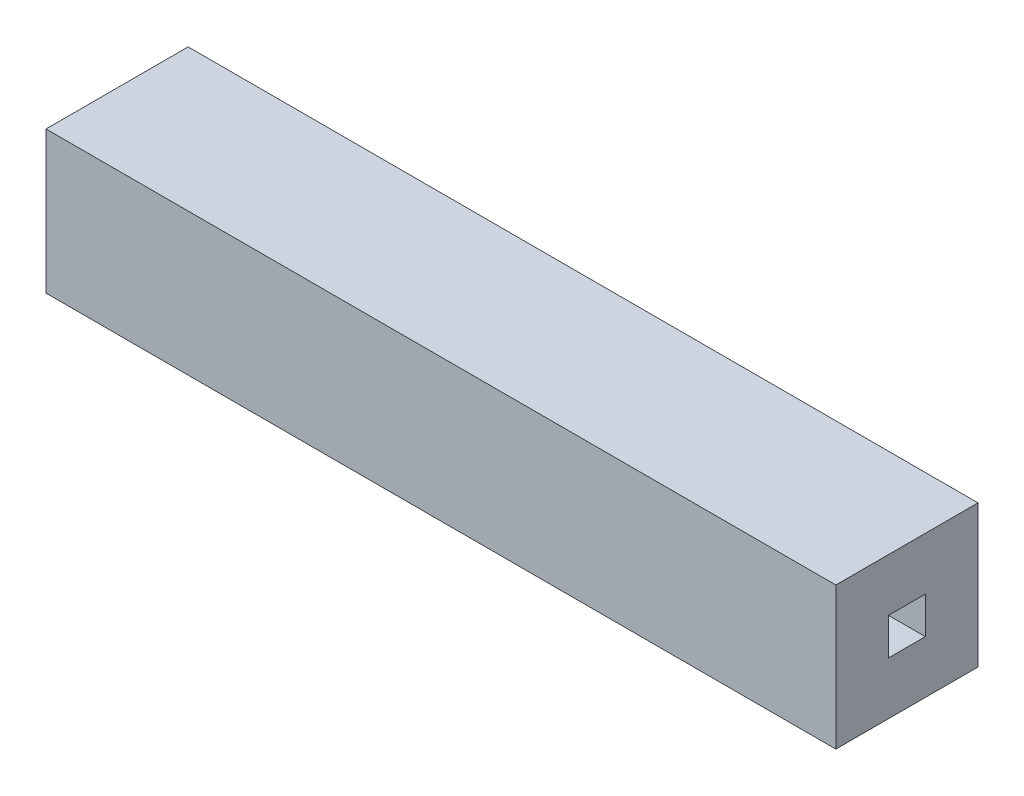
ISO-10303-21;
HEADER;
FILE_DESCRIPTION(('STEP AP214'),'2;1');
FILE_NAME('part.step','',(''),(''),'','','');
FILE_SCHEMA(('AUTOMOTIVE_DESIGN { 1 0 10303 214 1 1 1 1 }'));
ENDSEC;
DATA;
#1=APPLICATION_CONTEXT('core data for automotive mechanical design processes');
#2=APPLICATION_PROTOCOL_DEFINITION('international standard','automotive_design',2000,#1);
#3=PRODUCT_CONTEXT('',#1,'mechanical');
#4=PRODUCT('Part','Part','',(#3));
#5=PRODUCT_RELATED_PRODUCT_CATEGORY('part','',(#4));
#6=PRODUCT_DEFINITION_FORMATION('','',#4);
#7=PRODUCT_DEFINITION_CONTEXT('part definition',#1,'design');
#8=PRODUCT_DEFINITION('design','',#6,#7);
#9=PRODUCT_DEFINITION_SHAPE('','',#8);
#10=(LENGTH_UNIT() NAMED_UNIT(*) SI_UNIT(.MILLI.,.METRE.));
#11=(NAMED_UNIT(*) PLANE_ANGLE_UNIT() SI_UNIT($,.RADIAN.));
#12=(NAMED_UNIT(*) SI_UNIT($,.STERADIAN.) SOLID_ANGLE_UNIT());
#13=UNCERTAINTY_MEASURE_WITH_UNIT(LENGTH_MEASURE(1.E-05),#10,'distance_accuracy_value','');
#14=(GEOMETRIC_REPRESENTATION_CONTEXT(3) GLOBAL_UNCERTAINTY_ASSIGNED_CONTEXT((#13)) GLOBAL_UNIT_ASSIGNED_CONTEXT((#10,
#11,#12)) REPRESENTATION_CONTEXT('',''));
#15=CARTESIAN_POINT('',(0.,0.,0.));
#16=DIRECTION('',(0.,0.,1.));
#17=DIRECTION('',(1.,0.,0.));
#18=AXIS2_PLACEMENT_3D('',#15,#16,#17);
#19=CARTESIAN_POINT('',(15.,0.,0.));
#20=DIRECTION('',(-1.,0.,0.));
#21=DIRECTION('',(0.,0.,1.));
#22=AXIS2_PLACEMENT_3D('',#19,#20,#21);
#23=PLANE('',#22);
#24=DIRECTION('',(0.,-1.,0.));
#25=VECTOR('',#24,1.);
#26=CARTESIAN_POINT('',(15.,0.,0.));
#27=LINE('',#26,#25);
#28=CARTESIAN_POINT('',(15.,2.7,0.));
#29=VERTEX_POINT('',#28);
#30=CARTESIAN_POINT('',(15.,0.,0.));
#31=VERTEX_POINT('',#30);
#32=EDGE_CURVE('E139',#29,#31,#27,.T.);
#33=ORIENTED_EDGE('',*,*,#32,.T.);
#34=DIRECTION('',(0.,0.,-1.));
#35=VECTOR('',#34,1.);
#36=CARTESIAN_POINT('',(15.,0.,0.));
#37=LINE('',#36,#35);
#38=CARTESIAN_POINT('',(15.,0.,-2.7));
#39=VERTEX_POINT('',#38);
#40=EDGE_CURVE('E142',#31,#39,#37,.T.);
#41=ORIENTED_EDGE('',*,*,#40,.T.);
#42=DIRECTION('',(0.,1.,0.));
#43=VECTOR('',#42,1.);
#44=CARTESIAN_POINT('',(15.,0.,-2.7));
#45=LINE('',#44,#43);
#46=CARTESIAN_POINT('',(15.,2.7,-2.7));
#47=VERTEX_POINT('',#46);
#48=EDGE_CURVE('E145',#39,#47,#45,.T.);
#49=ORIENTED_EDGE('',*,*,#48,.T.);
#50=DIRECTION('',(0.,0.,1.));
#51=VECTOR('',#50,1.);
#52=CARTESIAN_POINT('',(15.,2.7,0.));
#53=LINE('',#52,#51);
#54=EDGE_CURVE('E147',#47,#29,#53,.T.);
#55=ORIENTED_EDGE('',*,*,#54,.T.);
#56=EDGE_LOOP('',(#33,#41,#49,#55));
#57=FACE_BOUND('',#56,.T.);
#58=DIRECTION('',(0.,-1.,0.));
#59=VECTOR('',#58,1.);
#60=CARTESIAN_POINT('',(15.,1.,-1.));
#61=LINE('',#60,#59);
#62=CARTESIAN_POINT('',(15.,1.7,-1.));
#63=VERTEX_POINT('',#62);
#64=CARTESIAN_POINT('',(15.,1.,-1.));
#65=VERTEX_POINT('',#64);
#66=EDGE_CURVE('E103',#63,#65,#61,.T.);
#67=ORIENTED_EDGE('',*,*,#66,.F.);
#68=DIRECTION('',(0.,0.,1.));
#69=VECTOR('',#68,1.);
#70=CARTESIAN_POINT('',(15.,1.7,-1.));
#71=LINE('',#70,#69);
#72=CARTESIAN_POINT('',(15.,1.7,-1.7));
#73=VERTEX_POINT('',#72);
#74=EDGE_CURVE('E125',#73,#63,#71,.T.);
#75=ORIENTED_EDGE('',*,*,#74,.F.);
#76=DIRECTION('',(0.,1.,0.));
#77=VECTOR('',#76,1.);
#78=CARTESIAN_POINT('',(15.,1.,-1.7));
#79=LINE('',#78,#77);
#80=CARTESIAN_POINT('',(15.,1.,-1.7));
#81=VERTEX_POINT('',#80);
#82=EDGE_CURVE('E123',#81,#73,#79,.T.);
#83=ORIENTED_EDGE('',*,*,#82,.F.);
#84=DIRECTION('',(0.,0.,-1.));
#85=VECTOR('',#84,1.);
#86=CARTESIAN_POINT('',(15.,1.,-1.));
#87=LINE('',#86,#85);
#88=EDGE_CURVE('E111',#65,#81,#87,.T.);
#89=ORIENTED_EDGE('',*,*,#88,.F.);
#90=EDGE_LOOP('',(#67,#75,#83,#89));
#91=FACE_BOUND('',#90,.T.);
#92=ADVANCED_FACE('F38',(#57,#91),#23,.F.);
#93=CARTESIAN_POINT('',(0.,0.,0.));
#94=DIRECTION('',(-1.,0.,0.));
#95=DIRECTION('',(0.,0.,1.));
#96=AXIS2_PLACEMENT_3D('',#93,#94,#95);
#97=PLANE('',#96);
#98=DIRECTION('',(0.,-1.,0.));
#99=VECTOR('',#98,1.);
#100=CARTESIAN_POINT('',(0.,0.,0.));
#101=LINE('',#100,#99);
#102=CARTESIAN_POINT('',(0.,2.7,0.));
#103=VERTEX_POINT('',#102);
#104=CARTESIAN_POINT('',(0.,0.,0.));
#105=VERTEX_POINT('',#104);
#106=EDGE_CURVE('E119',#103,#105,#101,.T.);
#107=ORIENTED_EDGE('',*,*,#106,.F.);
#108=DIRECTION('',(0.,0.,1.));
#109=VECTOR('',#108,1.);
#110=CARTESIAN_POINT('',(0.,2.7,0.));
#111=LINE('',#110,#109);
#112=CARTESIAN_POINT('',(0.,2.7,-2.7));
#113=VERTEX_POINT('',#112);
#114=EDGE_CURVE('E143',#113,#103,#111,.T.);
#115=ORIENTED_EDGE('',*,*,#114,.F.);
#116=DIRECTION('',(0.,1.,0.));
#117=VECTOR('',#116,1.);
#118=CARTESIAN_POINT('',(0.,0.,-2.7));
#119=LINE('',#118,#117);
#120=CARTESIAN_POINT('',(0.,0.,-2.7));
#121=VERTEX_POINT('',#120);
#122=EDGE_CURVE('E154',#121,#113,#119,.T.);
#123=ORIENTED_EDGE('',*,*,#122,.F.);
#124=DIRECTION('',(0.,0.,-1.));
#125=VECTOR('',#124,1.);
#126=CARTESIAN_POINT('',(0.,0.,0.));
#127=LINE('',#126,#125);
#128=EDGE_CURVE('E152',#105,#121,#127,.T.);
#129=ORIENTED_EDGE('',*,*,#128,.F.);
#130=EDGE_LOOP('',(#107,#115,#123,#129));
#131=FACE_BOUND('',#130,.T.);
#132=DIRECTION('',(0.,0.,1.));
#133=VECTOR('',#132,1.);
#134=CARTESIAN_POINT('',(0.,1.7,-1.));
#135=LINE('',#134,#133);
#136=CARTESIAN_POINT('',(0.,1.7,-1.7));
#137=VERTEX_POINT('',#136);
#138=CARTESIAN_POINT('',(0.,1.7,-1.));
#139=VERTEX_POINT('',#138);
#140=EDGE_CURVE('E112',#137,#139,#135,.T.);
#141=ORIENTED_EDGE('',*,*,#140,.T.);
#142=DIRECTION('',(0.,-1.,0.));
#143=VECTOR('',#142,1.);
#144=CARTESIAN_POINT('',(0.,1.,-1.));
#145=LINE('',#144,#143);
#146=CARTESIAN_POINT('',(0.,1.,-1.));
#147=VERTEX_POINT('',#146);
#148=EDGE_CURVE('E61',#139,#147,#145,.T.);
#149=ORIENTED_EDGE('',*,*,#148,.T.);
#150=DIRECTION('',(0.,0.,-1.));
#151=VECTOR('',#150,1.);
#152=CARTESIAN_POINT('',(0.,1.,-1.));
#153=LINE('',#152,#151);
#154=CARTESIAN_POINT('',(0.,1.,-1.7));
#155=VERTEX_POINT('',#154);
#156=EDGE_CURVE('E118',#147,#155,#153,.T.);
#157=ORIENTED_EDGE('',*,*,#156,.T.);
#158=DIRECTION('',(0.,1.,0.));
#159=VECTOR('',#158,1.);
#160=CARTESIAN_POINT('',(0.,1.,-1.7));
#161=LINE('',#160,#159);
#162=EDGE_CURVE('E131',#155,#137,#161,.T.);
#163=ORIENTED_EDGE('',*,*,#162,.T.);
#164=EDGE_LOOP('',(#141,#149,#157,#163));
#165=FACE_BOUND('',#164,.T.);
#166=ADVANCED_FACE('F172',(#131,#165),#97,.T.);
#167=CARTESIAN_POINT('',(15.,0.,0.));
#168=DIRECTION('',(0.,0.,-1.));
#169=DIRECTION('',(-1.,0.,0.));
#170=AXIS2_PLACEMENT_3D('',#167,#168,#169);
#171=PLANE('',#170);
#172=ORIENTED_EDGE('',*,*,#106,.T.);
#173=DIRECTION('',(-1.,0.,0.));
#174=VECTOR('',#173,1.);
#175=CARTESIAN_POINT('',(15.,0.,0.));
#176=LINE('',#175,#174);
#177=EDGE_CURVE('E11',#31,#105,#176,.T.);
#178=ORIENTED_EDGE('',*,*,#177,.F.);
#179=ORIENTED_EDGE('',*,*,#32,.F.);
#180=DIRECTION('',(-1.,0.,0.));
#181=VECTOR('',#180,1.);
#182=CARTESIAN_POINT('',(15.,2.7,0.));
#183=LINE('',#182,#181);
#184=EDGE_CURVE('E149',#29,#103,#183,.T.);
#185=ORIENTED_EDGE('',*,*,#184,.T.);
#186=EDGE_LOOP('',(#172,#178,#179,#185));
#187=FACE_BOUND('',#186,.T.);
#188=ADVANCED_FACE('F40',(#187),#171,.F.);
#189=CARTESIAN_POINT('',(15.,0.,0.));
#190=DIRECTION('',(0.,1.,0.));
#191=DIRECTION('',(0.,0.,1.));
#192=AXIS2_PLACEMENT_3D('',#189,#190,#191);
#193=PLANE('',#192);
#194=ORIENTED_EDGE('',*,*,#128,.T.);
#195=DIRECTION('',(-1.,0.,0.));
#196=VECTOR('',#195,1.);
#197=CARTESIAN_POINT('',(15.,0.,-2.7));
#198=LINE('',#197,#196);
#199=EDGE_CURVE('E46',#39,#121,#198,.T.);
#200=ORIENTED_EDGE('',*,*,#199,.F.);
#201=ORIENTED_EDGE('',*,*,#40,.F.);
#202=ORIENTED_EDGE('',*,*,#177,.T.);
#203=EDGE_LOOP('',(#194,#200,#201,#202));
#204=FACE_BOUND('',#203,.T.);
#205=ADVANCED_FACE('F182',(#204),#193,.F.);
#206=CARTESIAN_POINT('',(15.,0.,-2.7));
#207=DIRECTION('',(0.,0.,1.));
#208=DIRECTION('',(1.,0.,0.));
#209=AXIS2_PLACEMENT_3D('',#206,#207,#208);
#210=PLANE('',#209);
#211=ORIENTED_EDGE('',*,*,#122,.T.);
#212=DIRECTION('',(-1.,0.,0.));
#213=VECTOR('',#212,1.);
#214=CARTESIAN_POINT('',(15.,2.7,-2.7));
#215=LINE('',#214,#213);
#216=EDGE_CURVE('E159',#47,#113,#215,.T.);
#217=ORIENTED_EDGE('',*,*,#216,.F.);
#218=ORIENTED_EDGE('',*,*,#48,.F.);
#219=ORIENTED_EDGE('',*,*,#199,.T.);
#220=EDGE_LOOP('',(#211,#217,#218,#219));
#221=FACE_BOUND('',#220,.T.);
#222=ADVANCED_FACE('F166',(#221),#210,.F.);
#223=CARTESIAN_POINT('',(15.,2.7,0.));
#224=DIRECTION('',(0.,-1.,0.));
#225=DIRECTION('',(0.,0.,-1.));
#226=AXIS2_PLACEMENT_3D('',#223,#224,#225);
#227=PLANE('',#226);
#228=ORIENTED_EDGE('',*,*,#114,.T.);
#229=ORIENTED_EDGE('',*,*,#184,.F.);
#230=ORIENTED_EDGE('',*,*,#54,.F.);
#231=ORIENTED_EDGE('',*,*,#216,.T.);
#232=EDGE_LOOP('',(#228,#229,#230,#231));
#233=FACE_BOUND('',#232,.T.);
#234=ADVANCED_FACE('F176',(#233),#227,.F.);
#235=CARTESIAN_POINT('',(15.,1.,-1.));
#236=DIRECTION('',(0.,0.,-1.));
#237=DIRECTION('',(-1.,0.,0.));
#238=AXIS2_PLACEMENT_3D('',#235,#236,#237);
#239=PLANE('',#238);
#240=ORIENTED_EDGE('',*,*,#148,.F.);
#241=DIRECTION('',(-1.,0.,0.));
#242=VECTOR('',#241,1.);
#243=CARTESIAN_POINT('',(15.,1.7,-1.));
#244=LINE('',#243,#242);
#245=EDGE_CURVE('E107',#63,#139,#244,.T.);
#246=ORIENTED_EDGE('',*,*,#245,.F.);
#247=ORIENTED_EDGE('',*,*,#66,.T.);
#248=DIRECTION('',(-1.,0.,0.));
#249=VECTOR('',#248,1.);
#250=CARTESIAN_POINT('',(15.,1.,-1.));
#251=LINE('',#250,#249);
#252=EDGE_CURVE('E106',#65,#147,#251,.T.);
#253=ORIENTED_EDGE('',*,*,#252,.T.);
#254=EDGE_LOOP('',(#240,#246,#247,#253));
#255=FACE_BOUND('',#254,.T.);
#256=ADVANCED_FACE('F105',(#255),#239,.T.);
#257=CARTESIAN_POINT('',(15.,1.,-1.));
#258=DIRECTION('',(0.,1.,0.));
#259=DIRECTION('',(0.,0.,1.));
#260=AXIS2_PLACEMENT_3D('',#257,#258,#259);
#261=PLANE('',#260);
#262=ORIENTED_EDGE('',*,*,#156,.F.);
#263=ORIENTED_EDGE('',*,*,#252,.F.);
#264=ORIENTED_EDGE('',*,*,#88,.T.);
#265=DIRECTION('',(-1.,0.,0.));
#266=VECTOR('',#265,1.);
#267=CARTESIAN_POINT('',(15.,1.,-1.7));
#268=LINE('',#267,#266);
#269=EDGE_CURVE('E120',#81,#155,#268,.T.);
#270=ORIENTED_EDGE('',*,*,#269,.T.);
#271=EDGE_LOOP('',(#262,#263,#264,#270));
#272=FACE_BOUND('',#271,.T.);
#273=ADVANCED_FACE('F115',(#272),#261,.T.);
#274=CARTESIAN_POINT('',(15.,1.,-1.7));
#275=DIRECTION('',(0.,0.,1.));
#276=DIRECTION('',(1.,0.,0.));
#277=AXIS2_PLACEMENT_3D('',#274,#275,#276);
#278=PLANE('',#277);
#279=ORIENTED_EDGE('',*,*,#162,.F.);
#280=ORIENTED_EDGE('',*,*,#269,.F.);
#281=ORIENTED_EDGE('',*,*,#82,.T.);
#282=DIRECTION('',(-1.,0.,0.));
#283=VECTOR('',#282,1.);
#284=CARTESIAN_POINT('',(15.,1.7,-1.7));
#285=LINE('',#284,#283);
#286=EDGE_CURVE('E53',#73,#137,#285,.T.);
#287=ORIENTED_EDGE('',*,*,#286,.T.);
#288=EDGE_LOOP('',(#279,#280,#281,#287));
#289=FACE_BOUND('',#288,.T.);
#290=ADVANCED_FACE('F205',(#289),#278,.T.);
#291=CARTESIAN_POINT('',(15.,1.7,-1.));
#292=DIRECTION('',(0.,-1.,0.));
#293=DIRECTION('',(0.,0.,-1.));
#294=AXIS2_PLACEMENT_3D('',#291,#292,#293);
#295=PLANE('',#294);
#296=ORIENTED_EDGE('',*,*,#140,.F.);
#297=ORIENTED_EDGE('',*,*,#286,.F.);
#298=ORIENTED_EDGE('',*,*,#74,.T.);
#299=ORIENTED_EDGE('',*,*,#245,.T.);
#300=EDGE_LOOP('',(#296,#297,#298,#299));
#301=FACE_BOUND('',#300,.T.);
#302=ADVANCED_FACE('F209',(#301),#295,.T.);
#303=CLOSED_SHELL('',(#92,#166,#188,#205,#222,#234,#256,#273,#290,#302));
#304=MANIFOLD_SOLID_BREP('B2',#303);
#305=ADVANCED_BREP_SHAPE_REPRESENTATION('',(#18,#304),#14);
#306=SHAPE_DEFINITION_REPRESENTATION(#9,#305);
ENDSEC;
END-ISO-10303-21;
